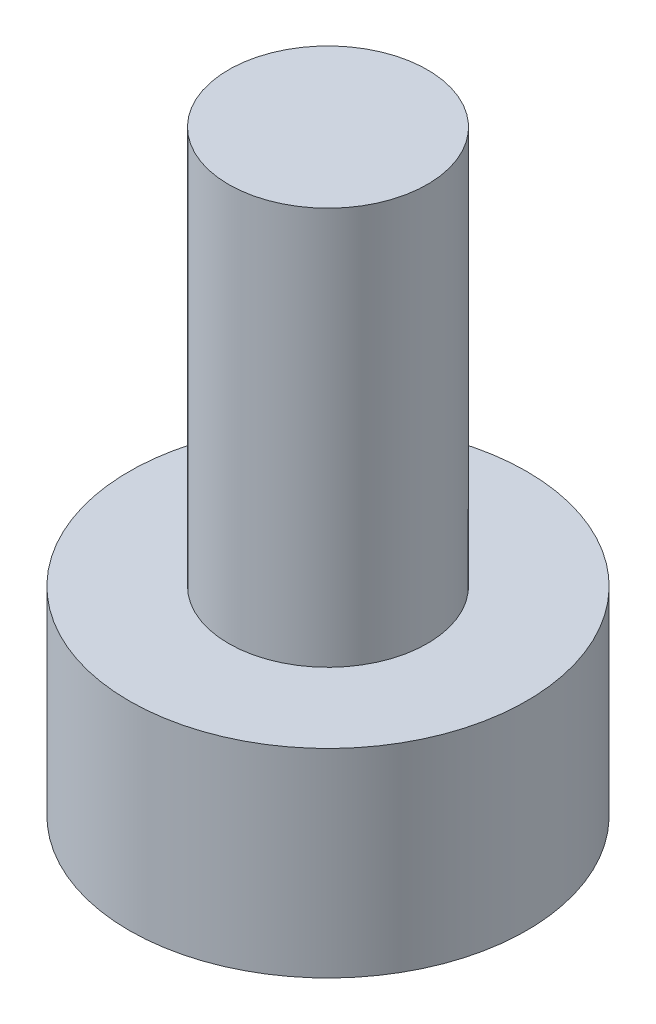
ISO-10303-21;
HEADER;
FILE_DESCRIPTION(('STEP AP214'),'2;1');
FILE_NAME('part.step','',(''),(''),'','','');
FILE_SCHEMA(('AUTOMOTIVE_DESIGN { 1 0 10303 214 1 1 1 1 }'));
ENDSEC;
DATA;
#1=APPLICATION_CONTEXT('core data for automotive mechanical design processes');
#2=APPLICATION_PROTOCOL_DEFINITION('international standard','automotive_design',2000,#1);
#3=PRODUCT_CONTEXT('',#1,'mechanical');
#4=PRODUCT('Part','Part','',(#3));
#5=PRODUCT_RELATED_PRODUCT_CATEGORY('part','',(#4));
#6=PRODUCT_DEFINITION_FORMATION('','',#4);
#7=PRODUCT_DEFINITION_CONTEXT('part definition',#1,'design');
#8=PRODUCT_DEFINITION('design','',#6,#7);
#9=PRODUCT_DEFINITION_SHAPE('','',#8);
#10=(LENGTH_UNIT() NAMED_UNIT(*) SI_UNIT(.MILLI.,.METRE.));
#11=(NAMED_UNIT(*) PLANE_ANGLE_UNIT() SI_UNIT($,.RADIAN.));
#12=(NAMED_UNIT(*) SI_UNIT($,.STERADIAN.) SOLID_ANGLE_UNIT());
#13=UNCERTAINTY_MEASURE_WITH_UNIT(LENGTH_MEASURE(1.E-05),#10,'distance_accuracy_value','');
#14=(GEOMETRIC_REPRESENTATION_CONTEXT(3) GLOBAL_UNCERTAINTY_ASSIGNED_CONTEXT((#13)) GLOBAL_UNIT_ASSIGNED_CONTEXT((#10,
#11,#12)) REPRESENTATION_CONTEXT('',''));
#15=CARTESIAN_POINT('',(0.,0.,0.));
#16=DIRECTION('',(0.,0.,1.));
#17=DIRECTION('',(1.,0.,0.));
#18=AXIS2_PLACEMENT_3D('',#15,#16,#17);
#19=CARTESIAN_POINT('',(0.,3.,0.));
#20=DIRECTION('',(0.,-1.,0.));
#21=DIRECTION('',(0.,0.,-1.));
#22=AXIS2_PLACEMENT_3D('',#19,#20,#21);
#23=CYLINDRICAL_SURFACE('',#22,3.);
#24=CARTESIAN_POINT('',(0.,3.,0.));
#25=DIRECTION('',(0.,1.,0.));
#26=DIRECTION('',(0.,0.,1.));
#27=AXIS2_PLACEMENT_3D('',#24,#25,#26);
#28=CIRCLE('',#27,3.);
#29=CARTESIAN_POINT('',(0.,3.,3.));
#30=VERTEX_POINT('',#29);
#31=EDGE_CURVE('E40',#30,#30,#28,.T.);
#32=ORIENTED_EDGE('',*,*,#31,.F.);
#33=EDGE_LOOP('',(#32));
#34=FACE_BOUND('',#33,.T.);
#35=CARTESIAN_POINT('',(0.,0.,0.));
#36=DIRECTION('',(0.,1.,0.));
#37=DIRECTION('',(0.,0.,1.));
#38=AXIS2_PLACEMENT_3D('',#35,#36,#37);
#39=CIRCLE('',#38,3.);
#40=CARTESIAN_POINT('',(0.,0.,3.));
#41=VERTEX_POINT('',#40);
#42=EDGE_CURVE('E36',#41,#41,#39,.T.);
#43=ORIENTED_EDGE('',*,*,#42,.T.);
#44=EDGE_LOOP('',(#43));
#45=FACE_BOUND('',#44,.T.);
#46=ADVANCED_FACE('F33',(#34,#45),#23,.T.);
#47=CARTESIAN_POINT('',(0.,3.,0.));
#48=DIRECTION('',(0.,1.,0.));
#49=DIRECTION('',(0.,0.,1.));
#50=AXIS2_PLACEMENT_3D('',#47,#48,#49);
#51=PLANE('',#50);
#52=CARTESIAN_POINT('',(0.,3.,0.));
#53=DIRECTION('',(0.,1.,0.));
#54=DIRECTION('',(0.,0.,1.));
#55=AXIS2_PLACEMENT_3D('',#52,#53,#54);
#56=CIRCLE('',#55,1.5);
#57=CARTESIAN_POINT('',(0.,3.,1.5));
#58=VERTEX_POINT('',#57);
#59=EDGE_CURVE('E10',#58,#58,#56,.T.);
#60=ORIENTED_EDGE('',*,*,#59,.F.);
#61=EDGE_LOOP('',(#60));
#62=FACE_BOUND('',#61,.T.);
#63=ORIENTED_EDGE('',*,*,#31,.T.);
#64=EDGE_LOOP('',(#63));
#65=FACE_BOUND('',#64,.T.);
#66=ADVANCED_FACE('F57',(#62,#65),#51,.T.);
#67=CARTESIAN_POINT('',(0.,0.,0.));
#68=DIRECTION('',(0.,1.,0.));
#69=DIRECTION('',(0.,0.,1.));
#70=AXIS2_PLACEMENT_3D('',#67,#68,#69);
#71=PLANE('',#70);
#72=ORIENTED_EDGE('',*,*,#42,.F.);
#73=EDGE_LOOP('',(#72));
#74=FACE_BOUND('',#73,.T.);
#75=ADVANCED_FACE('F54',(#74),#71,.F.);
#76=CARTESIAN_POINT('',(0.,9.,0.));
#77=DIRECTION('',(0.,-1.,0.));
#78=DIRECTION('',(0.,0.,-1.));
#79=AXIS2_PLACEMENT_3D('',#76,#77,#78);
#80=CYLINDRICAL_SURFACE('',#79,1.5);
#81=CARTESIAN_POINT('',(0.,9.,0.));
#82=DIRECTION('',(0.,1.,0.));
#83=DIRECTION('',(0.,0.,1.));
#84=AXIS2_PLACEMENT_3D('',#81,#82,#83);
#85=CIRCLE('',#84,1.5);
#86=CARTESIAN_POINT('',(0.,9.,1.5));
#87=VERTEX_POINT('',#86);
#88=EDGE_CURVE('E46',#87,#87,#85,.T.);
#89=ORIENTED_EDGE('',*,*,#88,.F.);
#90=EDGE_LOOP('',(#89));
#91=FACE_BOUND('',#90,.T.);
#92=ORIENTED_EDGE('',*,*,#59,.T.);
#93=EDGE_LOOP('',(#92));
#94=FACE_BOUND('',#93,.T.);
#95=ADVANCED_FACE('F56',(#91,#94),#80,.T.);
#96=CARTESIAN_POINT('',(0.,9.,0.));
#97=DIRECTION('',(0.,1.,0.));
#98=DIRECTION('',(0.,0.,1.));
#99=AXIS2_PLACEMENT_3D('',#96,#97,#98);
#100=PLANE('',#99);
#101=ORIENTED_EDGE('',*,*,#88,.T.);
#102=EDGE_LOOP('',(#101));
#103=FACE_BOUND('',#102,.T.);
#104=ADVANCED_FACE('F62',(#103),#100,.T.);
#105=CLOSED_SHELL('',(#46,#66,#75,#95,#104));
#106=MANIFOLD_SOLID_BREP('B2',#105);
#107=ADVANCED_BREP_SHAPE_REPRESENTATION('',(#18,#106),#14);
#108=SHAPE_DEFINITION_REPRESENTATION(#9,#107);
ENDSEC;
END-ISO-10303-21;
